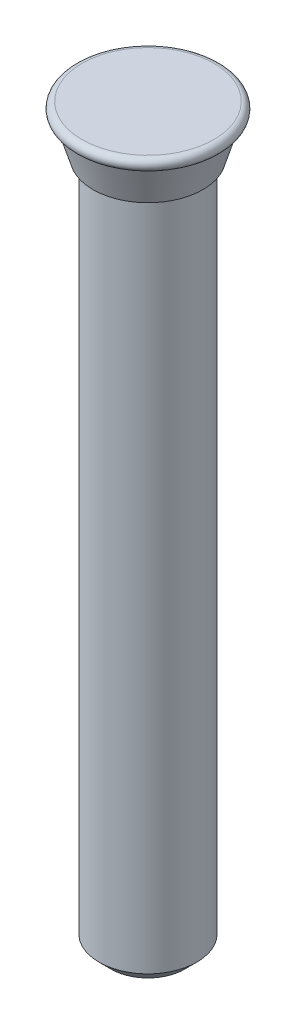
ISO-10303-21;
HEADER;
FILE_DESCRIPTION(('STEP AP214'),'2;1');
FILE_NAME('part.step','',(''),(''),'','','');
FILE_SCHEMA(('AUTOMOTIVE_DESIGN { 1 0 10303 214 1 1 1 1 }'));
ENDSEC;
DATA;
#1=APPLICATION_CONTEXT('core data for automotive mechanical design processes');
#2=APPLICATION_PROTOCOL_DEFINITION('international standard','automotive_design',2000,#1);
#3=PRODUCT_CONTEXT('',#1,'mechanical');
#4=PRODUCT('Part','Part','',(#3));
#5=PRODUCT_RELATED_PRODUCT_CATEGORY('part','',(#4));
#6=PRODUCT_DEFINITION_FORMATION('','',#4);
#7=PRODUCT_DEFINITION_CONTEXT('part definition',#1,'design');
#8=PRODUCT_DEFINITION('design','',#6,#7);
#9=PRODUCT_DEFINITION_SHAPE('','',#8);
#10=(LENGTH_UNIT() NAMED_UNIT(*) SI_UNIT(.MILLI.,.METRE.));
#11=(NAMED_UNIT(*) PLANE_ANGLE_UNIT() SI_UNIT($,.RADIAN.));
#12=(NAMED_UNIT(*) SI_UNIT($,.STERADIAN.) SOLID_ANGLE_UNIT());
#13=UNCERTAINTY_MEASURE_WITH_UNIT(LENGTH_MEASURE(1.E-05),#10,'distance_accuracy_value','');
#14=(GEOMETRIC_REPRESENTATION_CONTEXT(3) GLOBAL_UNCERTAINTY_ASSIGNED_CONTEXT((#13)) GLOBAL_UNIT_ASSIGNED_CONTEXT((#10,
#11,#12)) REPRESENTATION_CONTEXT('',''));
#15=CARTESIAN_POINT('',(0.,0.,0.));
#16=DIRECTION('',(0.,0.,1.));
#17=DIRECTION('',(1.,0.,0.));
#18=AXIS2_PLACEMENT_3D('',#15,#16,#17);
#19=CARTESIAN_POINT('',(0.,-29.5,0.));
#20=DIRECTION('',(0.,1.,0.));
#21=DIRECTION('',(0.,0.,1.));
#22=AXIS2_PLACEMENT_3D('',#19,#20,#21);
#23=CONICAL_SURFACE('',#22,2.00000000022441,0.785398163397448);
#24=CARTESIAN_POINT('',(0.,-30.0000000000325,0.));
#25=DIRECTION('',(0.,1.,0.));
#26=DIRECTION('',(0.,0.,1.));
#27=AXIS2_PLACEMENT_3D('',#24,#25,#26);
#28=CIRCLE('',#27,1.5000000001919);
#29=CARTESIAN_POINT('',(0.,-30.0000000000325,1.5000000001919));
#30=VERTEX_POINT('',#29);
#31=EDGE_CURVE('E10',#30,#30,#28,.T.);
#32=ORIENTED_EDGE('',*,*,#31,.T.);
#33=EDGE_LOOP('',(#32));
#34=FACE_BOUND('',#33,.T.);
#35=CARTESIAN_POINT('',(0.,-29.5,0.));
#36=DIRECTION('',(0.,1.,0.));
#37=DIRECTION('',(0.,0.,1.));
#38=AXIS2_PLACEMENT_3D('',#35,#36,#37);
#39=CIRCLE('',#38,2.00000000022441);
#40=CARTESIAN_POINT('',(0.,-29.5,2.00000000022441));
#41=VERTEX_POINT('',#40);
#42=EDGE_CURVE('E54',#41,#41,#39,.T.);
#43=ORIENTED_EDGE('',*,*,#42,.F.);
#44=EDGE_LOOP('',(#43));
#45=FACE_BOUND('',#44,.T.);
#46=ADVANCED_FACE('F32',(#34,#45),#23,.T.);
#47=CARTESIAN_POINT('',(1.5000000001919,-30.0000000000325,0.));
#48=DIRECTION('',(0.,-1.,0.));
#49=DIRECTION('',(0.,0.,-1.));
#50=AXIS2_PLACEMENT_3D('',#47,#48,#49);
#51=PLANE('',#50);
#52=ORIENTED_EDGE('',*,*,#31,.F.);
#53=EDGE_LOOP('',(#52));
#54=FACE_BOUND('',#53,.T.);
#55=ADVANCED_FACE('F62',(#54),#51,.T.);
#56=CARTESIAN_POINT('',(0.,0.,0.));
#57=DIRECTION('',(0.,1.,0.));
#58=DIRECTION('',(0.,0.,1.));
#59=AXIS2_PLACEMENT_3D('',#56,#57,#58);
#60=PLANE('',#59);
#61=CARTESIAN_POINT('',(0.,0.,0.));
#62=DIRECTION('',(0.,1.,0.));
#63=DIRECTION('',(0.,0.,1.));
#64=AXIS2_PLACEMENT_3D('',#61,#62,#63);
#65=CIRCLE('',#64,2.70000000022442);
#66=CARTESIAN_POINT('',(0.,0.,2.70000000022442));
#67=VERTEX_POINT('',#66);
#68=EDGE_CURVE('E38',#67,#67,#65,.T.);
#69=ORIENTED_EDGE('',*,*,#68,.T.);
#70=EDGE_LOOP('',(#69));
#71=FACE_BOUND('',#70,.T.);
#72=ADVANCED_FACE('F66',(#71),#60,.T.);
#73=CARTESIAN_POINT('',(0.,-0.249999999999997,0.));
#74=DIRECTION('',(0.,1.,0.));
#75=DIRECTION('',(0.,0.,1.));
#76=AXIS2_PLACEMENT_3D('',#73,#74,#75);
#77=TOROIDAL_SURFACE('',#76,2.70000000022442,0.249999999999998);
#78=CARTESIAN_POINT('',(0.,-0.499999999999994,0.));
#79=DIRECTION('',(0.,1.,0.));
#80=DIRECTION('',(0.,0.,1.));
#81=AXIS2_PLACEMENT_3D('',#78,#79,#80);
#82=CIRCLE('',#81,2.70000000022441);
#83=CARTESIAN_POINT('',(0.,-0.499999999999994,2.70000000022441));
#84=VERTEX_POINT('',#83);
#85=EDGE_CURVE('E42',#84,#84,#82,.T.);
#86=ORIENTED_EDGE('',*,*,#85,.T.);
#87=EDGE_LOOP('',(#86));
#88=FACE_BOUND('',#87,.T.);
#89=ORIENTED_EDGE('',*,*,#68,.F.);
#90=EDGE_LOOP('',(#89));
#91=FACE_BOUND('',#90,.T.);
#92=ADVANCED_FACE('F71',(#88,#91),#77,.T.);
#93=CARTESIAN_POINT('',(0.,-0.499999999999994,0.));
#94=DIRECTION('',(0.,1.,0.));
#95=DIRECTION('',(0.,0.,1.));
#96=AXIS2_PLACEMENT_3D('',#93,#94,#95);
#97=CONICAL_SURFACE('',#96,2.70000000022441,0.291456794312238);
#98=CARTESIAN_POINT('',(0.,-2.,0.));
#99=DIRECTION('',(0.,1.,0.));
#100=DIRECTION('',(0.,0.,1.));
#101=AXIS2_PLACEMENT_3D('',#98,#99,#100);
#102=CIRCLE('',#101,2.25000000049522);
#103=CARTESIAN_POINT('',(0.,-2.,2.25000000049522));
#104=VERTEX_POINT('',#103);
#105=EDGE_CURVE('E46',#104,#104,#102,.T.);
#106=ORIENTED_EDGE('',*,*,#105,.T.);
#107=EDGE_LOOP('',(#106));
#108=FACE_BOUND('',#107,.T.);
#109=ORIENTED_EDGE('',*,*,#85,.F.);
#110=EDGE_LOOP('',(#109));
#111=FACE_BOUND('',#110,.T.);
#112=ADVANCED_FACE('F76',(#108,#111),#97,.T.);
#113=CARTESIAN_POINT('',(2.25000000049522,-2.,0.));
#114=DIRECTION('',(0.,-1.,0.));
#115=DIRECTION('',(0.,0.,-1.));
#116=AXIS2_PLACEMENT_3D('',#113,#114,#115);
#117=PLANE('',#116);
#118=CARTESIAN_POINT('',(0.,-2.,0.));
#119=DIRECTION('',(0.,1.,0.));
#120=DIRECTION('',(0.,0.,1.));
#121=AXIS2_PLACEMENT_3D('',#118,#119,#120);
#122=CIRCLE('',#121,2.00000000022441);
#123=CARTESIAN_POINT('',(0.,-2.,2.00000000022441));
#124=VERTEX_POINT('',#123);
#125=EDGE_CURVE('E51',#124,#124,#122,.T.);
#126=ORIENTED_EDGE('',*,*,#125,.T.);
#127=EDGE_LOOP('',(#126));
#128=FACE_BOUND('',#127,.T.);
#129=ORIENTED_EDGE('',*,*,#105,.F.);
#130=EDGE_LOOP('',(#129));
#131=FACE_BOUND('',#130,.T.);
#132=ADVANCED_FACE('F80',(#128,#131),#117,.T.);
#133=CARTESIAN_POINT('',(0.,-30.0000000000325,0.));
#134=DIRECTION('',(0.,1.,0.));
#135=DIRECTION('',(0.,0.,1.));
#136=AXIS2_PLACEMENT_3D('',#133,#134,#135);
#137=CYLINDRICAL_SURFACE('',#136,2.00000000022441);
#138=ORIENTED_EDGE('',*,*,#42,.T.);
#139=EDGE_LOOP('',(#138));
#140=FACE_BOUND('',#139,.T.);
#141=ORIENTED_EDGE('',*,*,#125,.F.);
#142=EDGE_LOOP('',(#141));
#143=FACE_BOUND('',#142,.T.);
#144=ADVANCED_FACE('F58',(#140,#143),#137,.T.);
#145=CLOSED_SHELL('',(#46,#55,#72,#92,#112,#132,#144));
#146=MANIFOLD_SOLID_BREP('B2',#145);
#147=ADVANCED_BREP_SHAPE_REPRESENTATION('',(#18,#146),#14);
#148=SHAPE_DEFINITION_REPRESENTATION(#9,#147);
ENDSEC;
END-ISO-10303-21;
